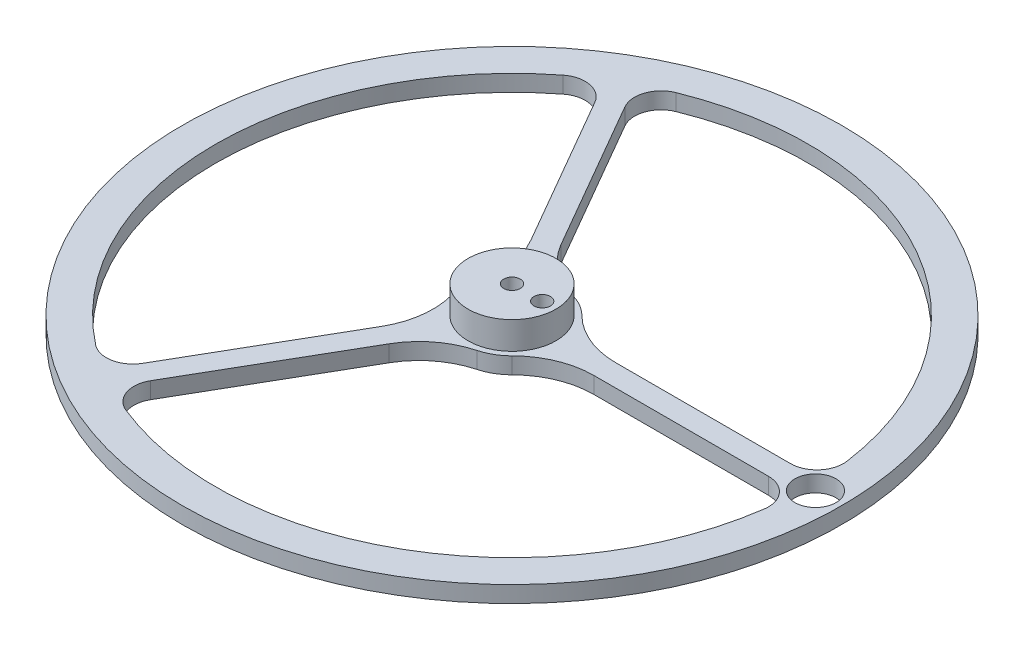
ISO-10303-21;
HEADER;
FILE_DESCRIPTION(('STEP AP214'),'2;1');
FILE_NAME('part.step','',(''),(''),'','','');
FILE_SCHEMA(('AUTOMOTIVE_DESIGN { 1 0 10303 214 1 1 1 1 }'));
ENDSEC;
DATA;
#1=APPLICATION_CONTEXT('core data for automotive mechanical design processes');
#2=APPLICATION_PROTOCOL_DEFINITION('international standard','automotive_design',2000,#1);
#3=PRODUCT_CONTEXT('',#1,'mechanical');
#4=PRODUCT('Part','Part','',(#3));
#5=PRODUCT_RELATED_PRODUCT_CATEGORY('part','',(#4));
#6=PRODUCT_DEFINITION_FORMATION('','',#4);
#7=PRODUCT_DEFINITION_CONTEXT('part definition',#1,'design');
#8=PRODUCT_DEFINITION('design','',#6,#7);
#9=PRODUCT_DEFINITION_SHAPE('','',#8);
#10=(LENGTH_UNIT() NAMED_UNIT(*) SI_UNIT(.MILLI.,.METRE.));
#11=(NAMED_UNIT(*) PLANE_ANGLE_UNIT() SI_UNIT($,.RADIAN.));
#12=(NAMED_UNIT(*) SI_UNIT($,.STERADIAN.) SOLID_ANGLE_UNIT());
#13=UNCERTAINTY_MEASURE_WITH_UNIT(LENGTH_MEASURE(1.E-05),#10,'distance_accuracy_value','');
#14=(GEOMETRIC_REPRESENTATION_CONTEXT(3) GLOBAL_UNCERTAINTY_ASSIGNED_CONTEXT((#13)) GLOBAL_UNIT_ASSIGNED_CONTEXT((#10,
#11,#12)) REPRESENTATION_CONTEXT('',''));
#15=CARTESIAN_POINT('',(0.,0.,0.));
#16=DIRECTION('',(0.,0.,1.));
#17=DIRECTION('',(1.,0.,0.));
#18=AXIS2_PLACEMENT_3D('',#15,#16,#17);
#19=CARTESIAN_POINT('',(0.,3.,0.));
#20=DIRECTION('',(0.,-1.,0.));
#21=DIRECTION('',(0.,0.,-1.));
#22=AXIS2_PLACEMENT_3D('',#19,#20,#21);
#23=CYLINDRICAL_SURFACE('',#22,54.);
#24=DIRECTION('',(0.,-1.,0.));
#25=VECTOR('',#24,1.);
#26=CARTESIAN_POINT('',(-33.2335057333473,55.9166560086537,-42.5621204437886));
#27=LINE('',#26,#25);
#28=CARTESIAN_POINT('',(-33.2335057333473,3.,-42.5621204437886));
#29=VERTEX_POINT('',#28);
#30=CARTESIAN_POINT('',(-33.2335057333473,0.,-42.5621204437886));
#31=VERTEX_POINT('',#30);
#32=EDGE_CURVE('E271',#29,#31,#27,.T.);
#33=ORIENTED_EDGE('',*,*,#32,.F.);
#34=CARTESIAN_POINT('',(0.,3.,0.));
#35=DIRECTION('',(0.,1.,0.));
#36=DIRECTION('',(0.,0.,1.));
#37=AXIS2_PLACEMENT_3D('',#34,#35,#36);
#38=CIRCLE('',#37,54.);
#39=CARTESIAN_POINT('',(-33.2335057333467,3.,42.5621204437891));
#40=VERTEX_POINT('',#39);
#41=EDGE_CURVE('E459',#29,#40,#38,.T.);
#42=ORIENTED_EDGE('',*,*,#41,.T.);
#43=DIRECTION('',(0.,-1.,0.));
#44=VECTOR('',#43,1.);
#45=CARTESIAN_POINT('',(-33.2335057333467,55.9166560086537,42.5621204437891));
#46=LINE('',#45,#44);
#47=CARTESIAN_POINT('',(-33.2335057333467,0.,42.5621204437891));
#48=VERTEX_POINT('',#47);
#49=EDGE_CURVE('E329',#40,#48,#46,.T.);
#50=ORIENTED_EDGE('',*,*,#49,.T.);
#51=CARTESIAN_POINT('',(0.,0.,0.));
#52=DIRECTION('',(0.,1.,0.));
#53=DIRECTION('',(0.,0.,1.));
#54=AXIS2_PLACEMENT_3D('',#51,#52,#53);
#55=CIRCLE('',#54,54.);
#56=EDGE_CURVE('E463',#31,#48,#55,.T.);
#57=ORIENTED_EDGE('',*,*,#56,.F.);
#58=EDGE_LOOP('',(#33,#42,#50,#57));
#59=FACE_BOUND('',#58,.T.);
#60=ADVANCED_FACE('F43',(#59),#23,.F.);
#61=DIRECTION('',(0.,-1.,0.));
#62=VECTOR('',#61,1.);
#63=CARTESIAN_POINT('',(-20.2431246765801,54.4469309590523,50.062120443789));
#64=LINE('',#63,#62);
#65=CARTESIAN_POINT('',(-20.2431246765801,3.,50.062120443789));
#66=VERTEX_POINT('',#65);
#67=CARTESIAN_POINT('',(-20.2431246765801,0.,50.062120443789));
#68=VERTEX_POINT('',#67);
#69=EDGE_CURVE('E308',#66,#68,#64,.T.);
#70=ORIENTED_EDGE('',*,*,#69,.F.);
#71=CARTESIAN_POINT('',(53.4766304099277,3.,7.50000000000001));
#72=VERTEX_POINT('',#71);
#73=EDGE_CURVE('E460',#66,#72,#38,.T.);
#74=ORIENTED_EDGE('',*,*,#73,.T.);
#75=DIRECTION('',(0.,-1.,0.));
#76=VECTOR('',#75,1.);
#77=CARTESIAN_POINT('',(53.4766304099277,51.2228390774193,7.5));
#78=LINE('',#77,#76);
#79=CARTESIAN_POINT('',(53.4766304099277,0.,7.5));
#80=VERTEX_POINT('',#79);
#81=EDGE_CURVE('E422',#72,#80,#78,.T.);
#82=ORIENTED_EDGE('',*,*,#81,.T.);
#83=EDGE_CURVE('E437',#68,#80,#55,.T.);
#84=ORIENTED_EDGE('',*,*,#83,.F.);
#85=EDGE_LOOP('',(#70,#74,#82,#84));
#86=FACE_BOUND('',#85,.T.);
#87=ADVANCED_FACE('F486',(#86),#23,.F.);
#88=CARTESIAN_POINT('',(0.,3.,0.));
#89=DIRECTION('',(0.,-1.,0.));
#90=DIRECTION('',(0.,0.,-1.));
#91=AXIS2_PLACEMENT_3D('',#88,#89,#90);
#92=CYLINDRICAL_SURFACE('',#91,9.);
#93=CARTESIAN_POINT('',(0.,3.,0.));
#94=DIRECTION('',(0.,1.,0.));
#95=DIRECTION('',(0.,0.,1.));
#96=AXIS2_PLACEMENT_3D('',#93,#94,#95);
#97=CIRCLE('',#96,9.);
#98=CARTESIAN_POINT('',(-8.69333243660163,3.,-2.32937140592264));
#99=VERTEX_POINT('',#98);
#100=CARTESIAN_POINT('',(-8.6933324366016,3.,2.32937140592276));
#101=VERTEX_POINT('',#100);
#102=EDGE_CURVE('E412',#99,#101,#97,.T.);
#103=ORIENTED_EDGE('',*,*,#102,.F.);
#104=DIRECTION('',(0.,-1.,0.));
#105=VECTOR('',#104,1.);
#106=CARTESIAN_POINT('',(-8.69333243660163,55.9166560086537,-2.32937140592264));
#107=LINE('',#106,#105);
#108=CARTESIAN_POINT('',(-8.69333243660163,0.,-2.32937140592264));
#109=VERTEX_POINT('',#108);
#110=EDGE_CURVE('E280',#99,#109,#107,.T.);
#111=ORIENTED_EDGE('',*,*,#110,.T.);
#112=CARTESIAN_POINT('',(0.,0.,0.));
#113=DIRECTION('',(0.,1.,0.));
#114=DIRECTION('',(0.,0.,1.));
#115=AXIS2_PLACEMENT_3D('',#112,#113,#114);
#116=CIRCLE('',#115,9.);
#117=CARTESIAN_POINT('',(-8.6933324366016,0.,2.32937140592276));
#118=VERTEX_POINT('',#117);
#119=EDGE_CURVE('E417',#109,#118,#116,.T.);
#120=ORIENTED_EDGE('',*,*,#119,.T.);
#121=DIRECTION('',(0.,-1.,0.));
#122=VECTOR('',#121,1.);
#123=CARTESIAN_POINT('',(-8.6933324366016,55.9166560086537,2.32937140592276));
#124=LINE('',#123,#122);
#125=EDGE_CURVE('E324',#101,#118,#124,.T.);
#126=ORIENTED_EDGE('',*,*,#125,.F.);
#127=EDGE_LOOP('',(#103,#111,#120,#126));
#128=FACE_BOUND('',#127,.T.);
#129=ADVANCED_FACE('F493',(#128),#92,.T.);
#130=CARTESIAN_POINT('',(2.32937140592278,3.,8.69333243660159));
#131=VERTEX_POINT('',#130);
#132=CARTESIAN_POINT('',(6.36396103067892,3.,6.36396103067893));
#133=VERTEX_POINT('',#132);
#134=EDGE_CURVE('E413',#131,#133,#97,.T.);
#135=ORIENTED_EDGE('',*,*,#134,.F.);
#136=DIRECTION('',(0.,-1.,0.));
#137=VECTOR('',#136,1.);
#138=CARTESIAN_POINT('',(2.32937140592278,54.4469309590523,8.69333243660159));
#139=LINE('',#138,#137);
#140=CARTESIAN_POINT('',(2.32937140592278,0.,8.69333243660159));
#141=VERTEX_POINT('',#140);
#142=EDGE_CURVE('E317',#131,#141,#139,.T.);
#143=ORIENTED_EDGE('',*,*,#142,.T.);
#144=CARTESIAN_POINT('',(6.36396103067892,0.,6.36396103067893));
#145=VERTEX_POINT('',#144);
#146=EDGE_CURVE('E404',#141,#145,#116,.T.);
#147=ORIENTED_EDGE('',*,*,#146,.T.);
#148=DIRECTION('',(0.,-1.,0.));
#149=VECTOR('',#148,1.);
#150=CARTESIAN_POINT('',(6.36396103067892,51.2228390774193,6.36396103067893));
#151=LINE('',#150,#149);
#152=EDGE_CURVE('E409',#133,#145,#151,.T.);
#153=ORIENTED_EDGE('',*,*,#152,.F.);
#154=EDGE_LOOP('',(#135,#143,#147,#153));
#155=FACE_BOUND('',#154,.T.);
#156=ADVANCED_FACE('F497',(#155),#92,.T.);
#157=DIRECTION('',(0.,-1.,0.));
#158=VECTOR('',#157,1.);
#159=CARTESIAN_POINT('',(53.4766304099277,51.2228390774193,-7.49999999999999));
#160=LINE('',#159,#158);
#161=CARTESIAN_POINT('',(53.4766304099277,3.,-7.49999999999999));
#162=VERTEX_POINT('',#161);
#163=CARTESIAN_POINT('',(53.4766304099277,0.,-7.49999999999999));
#164=VERTEX_POINT('',#163);
#165=EDGE_CURVE('E69',#162,#164,#160,.T.);
#166=ORIENTED_EDGE('',*,*,#165,.F.);
#167=CARTESIAN_POINT('',(-20.2431246765808,3.00000000000002,-50.0621204437887));
#168=VERTEX_POINT('',#167);
#169=EDGE_CURVE('E456',#162,#168,#38,.T.);
#170=ORIENTED_EDGE('',*,*,#169,.T.);
#171=DIRECTION('',(0.,-1.,0.));
#172=VECTOR('',#171,1.);
#173=CARTESIAN_POINT('',(-20.2431246765808,54.4469309590524,-50.0621204437887));
#174=LINE('',#173,#172);
#175=CARTESIAN_POINT('',(-20.2431246765808,0.,-50.0621204437887));
#176=VERTEX_POINT('',#175);
#177=EDGE_CURVE('E367',#168,#176,#174,.T.);
#178=ORIENTED_EDGE('',*,*,#177,.T.);
#179=EDGE_CURVE('E461',#164,#176,#55,.T.);
#180=ORIENTED_EDGE('',*,*,#179,.F.);
#181=EDGE_LOOP('',(#166,#170,#178,#180));
#182=FACE_BOUND('',#181,.T.);
#183=ADVANCED_FACE('F489',(#182),#23,.F.);
#184=CARTESIAN_POINT('',(6.36396103067892,3.,-6.36396103067893));
#185=VERTEX_POINT('',#184);
#186=CARTESIAN_POINT('',(2.32937140592266,3.00000000000002,-8.69333243660163));
#187=VERTEX_POINT('',#186);
#188=EDGE_CURVE('E61',#185,#187,#97,.T.);
#189=ORIENTED_EDGE('',*,*,#188,.F.);
#190=DIRECTION('',(0.,-1.,0.));
#191=VECTOR('',#190,1.);
#192=CARTESIAN_POINT('',(6.36396103067892,51.2228390774193,-6.36396103067894));
#193=LINE('',#192,#191);
#194=CARTESIAN_POINT('',(6.36396103067892,0.,-6.36396103067893));
#195=VERTEX_POINT('',#194);
#196=EDGE_CURVE('E231',#185,#195,#193,.T.);
#197=ORIENTED_EDGE('',*,*,#196,.T.);
#198=CARTESIAN_POINT('',(2.32937140592266,0.,-8.69333243660163));
#199=VERTEX_POINT('',#198);
#200=EDGE_CURVE('E414',#195,#199,#116,.T.);
#201=ORIENTED_EDGE('',*,*,#200,.T.);
#202=DIRECTION('',(0.,-1.,0.));
#203=VECTOR('',#202,1.);
#204=CARTESIAN_POINT('',(2.32937140592266,54.4469309590524,-8.69333243660163));
#205=LINE('',#204,#203);
#206=EDGE_CURVE('E344',#187,#199,#205,.T.);
#207=ORIENTED_EDGE('',*,*,#206,.F.);
#208=EDGE_LOOP('',(#189,#197,#201,#207));
#209=FACE_BOUND('',#208,.T.);
#210=ADVANCED_FACE('F480',(#209),#92,.T.);
#211=CARTESIAN_POINT('',(0.,3.,0.));
#212=DIRECTION('',(0.,1.,0.));
#213=DIRECTION('',(0.,0.,1.));
#214=AXIS2_PLACEMENT_3D('',#211,#212,#213);
#215=PLANE('',#214);
#216=CARTESIAN_POINT('',(55.25,3.,0.));
#217=DIRECTION('',(0.,1.,0.));
#218=DIRECTION('',(0.,0.,1.));
#219=AXIS2_PLACEMENT_3D('',#216,#217,#218);
#220=CIRCLE('',#219,3.75000000000001);
#221=CARTESIAN_POINT('',(55.25,3.,3.75000000000001));
#222=VERTEX_POINT('',#221);
#223=EDGE_CURVE('E987',#222,#222,#220,.T.);
#224=ORIENTED_EDGE('',*,*,#223,.F.);
#225=EDGE_LOOP('',(#224));
#226=FACE_BOUND('',#225,.T.);
#227=ORIENTED_EDGE('',*,*,#169,.F.);
#228=CARTESIAN_POINT('',(48.694167527739,3.,-6.82926829268293));
#229=DIRECTION('',(0.,1.,0.));
#230=DIRECTION('',(0.,0.,1.));
#231=AXIS2_PLACEMENT_3D('',#228,#229,#230);
#232=CIRCLE('',#231,4.82926829268293);
#233=CARTESIAN_POINT('',(48.694167527739,3.,-2.));
#234=VERTEX_POINT('',#233);
#235=EDGE_CURVE('E214',#234,#162,#232,.T.);
#236=ORIENTED_EDGE('',*,*,#235,.F.);
#237=DIRECTION('',(1.,0.,0.));
#238=VECTOR('',#237,1.);
#239=CARTESIAN_POINT('',(16.8994949366117,3.,-2.));
#240=LINE('',#239,#238);
#241=CARTESIAN_POINT('',(16.8994949366117,3.,-2.));
#242=VERTEX_POINT('',#241);
#243=EDGE_CURVE('E206',#242,#234,#240,.T.);
#244=ORIENTED_EDGE('',*,*,#243,.F.);
#245=CARTESIAN_POINT('',(16.8994949366117,3.,-16.8994949366117));
#246=DIRECTION('',(0.,1.,0.));
#247=DIRECTION('',(0.,0.,1.));
#248=AXIS2_PLACEMENT_3D('',#245,#246,#247);
#249=CIRCLE('',#248,14.8994949366117);
#250=EDGE_CURVE('E211',#185,#242,#249,.T.);
#251=ORIENTED_EDGE('',*,*,#250,.F.);
#252=ORIENTED_EDGE('',*,*,#188,.T.);
#253=CARTESIAN_POINT('',(6.18564445792628,3.,-23.0851393945381));
#254=DIRECTION('',(0.,1.,0.));
#255=DIRECTION('',(0.,0.,1.));
#256=AXIS2_PLACEMENT_3D('',#253,#254,#255);
#257=CIRCLE('',#256,14.8994949366117);
#258=CARTESIAN_POINT('',(-6.71769666073704,3.00000000000002,-15.6353919262322));
#259=VERTEX_POINT('',#258);
#260=EDGE_CURVE('E387',#187,#259,#257,.F.);
#261=ORIENTED_EDGE('',*,*,#260,.T.);
#262=DIRECTION('',(-0.500000000000004,0.,-0.866025403784436));
#263=VECTOR('',#262,1.);
#264=CARTESIAN_POINT('',(-6.71769666073704,3.,-15.6353919262322));
#265=LINE('',#264,#263);
#266=CARTESIAN_POINT('',(-22.6150329563008,3.00000000000002,-43.1703860951572));
#267=VERTEX_POINT('',#266);
#268=EDGE_CURVE('E383',#259,#267,#265,.T.);
#269=ORIENTED_EDGE('',*,*,#268,.T.);
#270=CARTESIAN_POINT('',(-18.4327639331467,3.,-45.5850202414987));
#271=DIRECTION('',(0.,1.,0.));
#272=DIRECTION('',(0.,0.,1.));
#273=AXIS2_PLACEMENT_3D('',#270,#271,#272);
#274=CIRCLE('',#273,4.82926829268293);
#275=EDGE_CURVE('E378',#267,#168,#274,.F.);
#276=ORIENTED_EDGE('',*,*,#275,.T.);
#277=EDGE_LOOP('',(#227,#236,#244,#251,#252,#261,#269,#276));
#278=FACE_BOUND('',#277,.T.);
#279=ORIENTED_EDGE('',*,*,#41,.F.);
#280=CARTESIAN_POINT('',(-30.2614035945927,3.,-38.7557519488157));
#281=DIRECTION('',(0.,1.,0.));
#282=DIRECTION('',(0.,0.,1.));
#283=AXIS2_PLACEMENT_3D('',#280,#281,#282);
#284=CIRCLE('',#283,4.82926829268293);
#285=CARTESIAN_POINT('',(-26.0791345714386,3.,-41.1703860951572));
#286=VERTEX_POINT('',#285);
#287=EDGE_CURVE('E267',#286,#29,#284,.T.);
#288=ORIENTED_EDGE('',*,*,#287,.F.);
#289=DIRECTION('',(-0.500000000000004,0.,-0.866025403784436));
#290=VECTOR('',#289,1.);
#291=CARTESIAN_POINT('',(-10.1817982758748,3.,-13.6353919262322));
#292=LINE('',#291,#290);
#293=CARTESIAN_POINT('',(-10.1817982758748,3.,-13.6353919262322));
#294=VERTEX_POINT('',#293);
#295=EDGE_CURVE('E273',#294,#286,#292,.T.);
#296=ORIENTED_EDGE('',*,*,#295,.F.);
#297=CARTESIAN_POINT('',(-23.0851393945381,3.,-6.18564445792625));
#298=DIRECTION('',(0.,1.,0.));
#299=DIRECTION('',(0.,0.,1.));
#300=AXIS2_PLACEMENT_3D('',#297,#298,#299);
#301=CIRCLE('',#300,14.8994949366117);
#302=EDGE_CURVE('E262',#99,#294,#301,.T.);
#303=ORIENTED_EDGE('',*,*,#302,.F.);
#304=ORIENTED_EDGE('',*,*,#102,.T.);
#305=CARTESIAN_POINT('',(-23.085139394538,3.,6.18564445792657));
#306=DIRECTION('',(0.,1.,0.));
#307=DIRECTION('',(0.,0.,1.));
#308=AXIS2_PLACEMENT_3D('',#305,#306,#307);
#309=CIRCLE('',#308,14.8994949366117);
#310=CARTESIAN_POINT('',(-10.1817982758746,3.,13.6353919262323));
#311=VERTEX_POINT('',#310);
#312=EDGE_CURVE('E349',#101,#311,#309,.F.);
#313=ORIENTED_EDGE('',*,*,#312,.T.);
#314=DIRECTION('',(-0.499999999999992,0.,0.866025403784443));
#315=VECTOR('',#314,1.);
#316=CARTESIAN_POINT('',(-10.1817982758746,3.,13.6353919262323));
#317=LINE('',#316,#315);
#318=CARTESIAN_POINT('',(-26.079134571438,3.,41.1703860951575));
#319=VERTEX_POINT('',#318);
#320=EDGE_CURVE('E345',#311,#319,#317,.T.);
#321=ORIENTED_EDGE('',*,*,#320,.T.);
#322=CARTESIAN_POINT('',(-30.2614035945921,3.,38.7557519488161));
#323=DIRECTION('',(0.,1.,0.));
#324=DIRECTION('',(0.,0.,1.));
#325=AXIS2_PLACEMENT_3D('',#322,#323,#324);
#326=CIRCLE('',#325,4.82926829268293);
#327=EDGE_CURVE('E340',#319,#40,#326,.F.);
#328=ORIENTED_EDGE('',*,*,#327,.T.);
#329=EDGE_LOOP('',(#279,#288,#296,#303,#304,#313,#321,#328));
#330=FACE_BOUND('',#329,.T.);
#331=ORIENTED_EDGE('',*,*,#73,.F.);
#332=CARTESIAN_POINT('',(-18.4327639331461,3.,45.5850202414989));
#333=DIRECTION('',(0.,1.,0.));
#334=DIRECTION('',(0.,0.,1.));
#335=AXIS2_PLACEMENT_3D('',#332,#333,#334);
#336=CIRCLE('',#335,4.82926829268293);
#337=CARTESIAN_POINT('',(-22.6150329563002,3.,43.1703860951575));
#338=VERTEX_POINT('',#337);
#339=EDGE_CURVE('E304',#338,#66,#336,.T.);
#340=ORIENTED_EDGE('',*,*,#339,.F.);
#341=DIRECTION('',(-0.499999999999992,0.,0.866025403784443));
#342=VECTOR('',#341,1.);
#343=CARTESIAN_POINT('',(-6.71769666073682,3.,15.6353919262323));
#344=LINE('',#343,#342);
#345=CARTESIAN_POINT('',(-6.71769666073682,3.,15.6353919262323));
#346=VERTEX_POINT('',#345);
#347=EDGE_CURVE('E310',#346,#338,#344,.T.);
#348=ORIENTED_EDGE('',*,*,#347,.F.);
#349=CARTESIAN_POINT('',(6.18564445792661,3.,23.085139394538));
#350=DIRECTION('',(0.,1.,0.));
#351=DIRECTION('',(0.,0.,1.));
#352=AXIS2_PLACEMENT_3D('',#349,#350,#351);
#353=CIRCLE('',#352,14.8994949366117);
#354=EDGE_CURVE('E299',#131,#346,#353,.T.);
#355=ORIENTED_EDGE('',*,*,#354,.F.);
#356=ORIENTED_EDGE('',*,*,#134,.T.);
#357=CARTESIAN_POINT('',(16.8994949366117,3.,16.8994949366117));
#358=DIRECTION('',(0.,1.,0.));
#359=DIRECTION('',(0.,0.,1.));
#360=AXIS2_PLACEMENT_3D('',#357,#358,#359);
#361=CIRCLE('',#360,14.8994949366117);
#362=CARTESIAN_POINT('',(16.8994949366117,3.,2.));
#363=VERTEX_POINT('',#362);
#364=EDGE_CURVE('E442',#133,#363,#361,.F.);
#365=ORIENTED_EDGE('',*,*,#364,.T.);
#366=DIRECTION('',(1.,0.,0.));
#367=VECTOR('',#366,1.);
#368=CARTESIAN_POINT('',(16.8994949366117,3.,2.));
#369=LINE('',#368,#367);
#370=CARTESIAN_POINT('',(48.694167527739,3.,2.));
#371=VERTEX_POINT('',#370);
#372=EDGE_CURVE('E438',#363,#371,#369,.T.);
#373=ORIENTED_EDGE('',*,*,#372,.T.);
#374=CARTESIAN_POINT('',(48.694167527739,3.,6.82926829268293));
#375=DIRECTION('',(0.,1.,0.));
#376=DIRECTION('',(0.,0.,1.));
#377=AXIS2_PLACEMENT_3D('',#374,#375,#376);
#378=CIRCLE('',#377,4.82926829268293);
#379=EDGE_CURVE('E433',#371,#72,#378,.F.);
#380=ORIENTED_EDGE('',*,*,#379,.T.);
#381=EDGE_LOOP('',(#331,#340,#348,#355,#356,#365,#373,#380));
#382=FACE_BOUND('',#381,.T.);
#383=CARTESIAN_POINT('',(0.,3.,0.));
#384=DIRECTION('',(0.,1.,0.));
#385=DIRECTION('',(0.,0.,1.));
#386=AXIS2_PLACEMENT_3D('',#383,#384,#385);
#387=CIRCLE('',#386,60.);
#388=CARTESIAN_POINT('',(0.,3.,60.));
#389=VERTEX_POINT('',#388);
#390=EDGE_CURVE('E11',#389,#389,#387,.T.);
#391=ORIENTED_EDGE('',*,*,#390,.T.);
#392=EDGE_LOOP('',(#391));
#393=FACE_BOUND('',#392,.T.);
#394=CARTESIAN_POINT('',(0.,3.,0.));
#395=DIRECTION('',(0.,1.,0.));
#396=DIRECTION('',(0.,0.,1.));
#397=AXIS2_PLACEMENT_3D('',#394,#395,#396);
#398=CIRCLE('',#397,8.);
#399=CARTESIAN_POINT('',(0.,3.,8.));
#400=VERTEX_POINT('',#399);
#401=EDGE_CURVE('E405',#400,#400,#398,.T.);
#402=ORIENTED_EDGE('',*,*,#401,.F.);
#403=EDGE_LOOP('',(#402));
#404=FACE_BOUND('',#403,.T.);
#405=ADVANCED_FACE('F208',(#226,#278,#330,#382,#393,#404),#215,.T.);
#406=CARTESIAN_POINT('',(0.,0.,0.));
#407=DIRECTION('',(0.,1.,0.));
#408=DIRECTION('',(0.,0.,1.));
#409=AXIS2_PLACEMENT_3D('',#406,#407,#408);
#410=PLANE('',#409);
#411=CARTESIAN_POINT('',(55.25,0.,0.));
#412=DIRECTION('',(0.,1.,0.));
#413=DIRECTION('',(0.,0.,1.));
#414=AXIS2_PLACEMENT_3D('',#411,#412,#413);
#415=CIRCLE('',#414,3.75000000000001);
#416=CARTESIAN_POINT('',(55.25,0.,3.75000000000001));
#417=VERTEX_POINT('',#416);
#418=EDGE_CURVE('E989',#417,#417,#415,.T.);
#419=ORIENTED_EDGE('',*,*,#418,.T.);
#420=EDGE_LOOP('',(#419));
#421=FACE_BOUND('',#420,.T.);
#422=CARTESIAN_POINT('',(0.,0.,0.));
#423=DIRECTION('',(0.,1.,0.));
#424=DIRECTION('',(0.,0.,1.));
#425=AXIS2_PLACEMENT_3D('',#422,#423,#424);
#426=CIRCLE('',#425,1.5);
#427=CARTESIAN_POINT('',(0.,0.,1.5));
#428=VERTEX_POINT('',#427);
#429=EDGE_CURVE('E636',#428,#428,#426,.T.);
#430=ORIENTED_EDGE('',*,*,#429,.T.);
#431=EDGE_LOOP('',(#430));
#432=FACE_BOUND('',#431,.T.);
#433=CARTESIAN_POINT('',(48.694167527739,0.,-6.82926829268293));
#434=DIRECTION('',(0.,1.,0.));
#435=DIRECTION('',(0.,0.,1.));
#436=AXIS2_PLACEMENT_3D('',#433,#434,#435);
#437=CIRCLE('',#436,4.82926829268293);
#438=CARTESIAN_POINT('',(48.694167527739,0.,-2.));
#439=VERTEX_POINT('',#438);
#440=EDGE_CURVE('E233',#439,#164,#437,.T.);
#441=ORIENTED_EDGE('',*,*,#440,.T.);
#442=ORIENTED_EDGE('',*,*,#179,.T.);
#443=CARTESIAN_POINT('',(-18.4327639331467,0.,-45.5850202414987));
#444=DIRECTION('',(0.,-1.,0.));
#445=DIRECTION('',(-0.866025403784436,0.,0.500000000000004));
#446=AXIS2_PLACEMENT_3D('',#443,#444,#445);
#447=CIRCLE('',#446,4.82926829268293);
#448=CARTESIAN_POINT('',(-22.6150329563008,0.,-43.1703860951572));
#449=VERTEX_POINT('',#448);
#450=EDGE_CURVE('E363',#449,#176,#447,.T.);
#451=ORIENTED_EDGE('',*,*,#450,.F.);
#452=DIRECTION('',(-0.500000000000004,0.,-0.866025403784436));
#453=VECTOR('',#452,1.);
#454=CARTESIAN_POINT('',(-6.71769666073704,0.,-15.6353919262322));
#455=LINE('',#454,#453);
#456=CARTESIAN_POINT('',(-6.71769666073704,0.,-15.6353919262322));
#457=VERTEX_POINT('',#456);
#458=EDGE_CURVE('E369',#457,#449,#455,.T.);
#459=ORIENTED_EDGE('',*,*,#458,.F.);
#460=CARTESIAN_POINT('',(6.18564445792628,0.,-23.0851393945381));
#461=DIRECTION('',(0.,-1.,0.));
#462=DIRECTION('',(0.866025403784436,0.,-0.500000000000004));
#463=AXIS2_PLACEMENT_3D('',#460,#461,#462);
#464=CIRCLE('',#463,14.8994949366117);
#465=EDGE_CURVE('E374',#199,#457,#464,.T.);
#466=ORIENTED_EDGE('',*,*,#465,.F.);
#467=ORIENTED_EDGE('',*,*,#200,.F.);
#468=CARTESIAN_POINT('',(16.8994949366117,0.,-16.8994949366117));
#469=DIRECTION('',(0.,1.,0.));
#470=DIRECTION('',(0.,0.,-1.));
#471=AXIS2_PLACEMENT_3D('',#468,#469,#470);
#472=CIRCLE('',#471,14.8994949366117);
#473=CARTESIAN_POINT('',(16.8994949366117,0.,-2.));
#474=VERTEX_POINT('',#473);
#475=EDGE_CURVE('E634',#195,#474,#472,.T.);
#476=ORIENTED_EDGE('',*,*,#475,.T.);
#477=DIRECTION('',(1.,0.,0.));
#478=VECTOR('',#477,1.);
#479=CARTESIAN_POINT('',(16.8994949366117,0.,-2.));
#480=LINE('',#479,#478);
#481=EDGE_CURVE('E224',#474,#439,#480,.T.);
#482=ORIENTED_EDGE('',*,*,#481,.T.);
#483=EDGE_LOOP('',(#441,#442,#451,#459,#466,#467,#476,#482));
#484=FACE_BOUND('',#483,.T.);
#485=CARTESIAN_POINT('',(-30.2614035945927,0.,-38.7557519488157));
#486=DIRECTION('',(0.,1.,0.));
#487=DIRECTION('',(0.866025403784436,0.,-0.500000000000004));
#488=AXIS2_PLACEMENT_3D('',#485,#486,#487);
#489=CIRCLE('',#488,4.82926829268293);
#490=CARTESIAN_POINT('',(-26.0791345714386,0.,-41.1703860951572));
#491=VERTEX_POINT('',#490);
#492=EDGE_CURVE('E258',#491,#31,#489,.T.);
#493=ORIENTED_EDGE('',*,*,#492,.T.);
#494=ORIENTED_EDGE('',*,*,#56,.T.);
#495=CARTESIAN_POINT('',(-30.2614035945921,0.,38.7557519488161));
#496=DIRECTION('',(0.,-1.,0.));
#497=DIRECTION('',(0.866025403784443,0.,0.499999999999992));
#498=AXIS2_PLACEMENT_3D('',#495,#496,#497);
#499=CIRCLE('',#498,4.82926829268293);
#500=CARTESIAN_POINT('',(-26.079134571438,0.,41.1703860951575));
#501=VERTEX_POINT('',#500);
#502=EDGE_CURVE('E325',#501,#48,#499,.T.);
#503=ORIENTED_EDGE('',*,*,#502,.F.);
#504=DIRECTION('',(-0.499999999999992,0.,0.866025403784443));
#505=VECTOR('',#504,1.);
#506=CARTESIAN_POINT('',(-10.1817982758746,0.,13.6353919262323));
#507=LINE('',#506,#505);
#508=CARTESIAN_POINT('',(-10.1817982758746,0.,13.6353919262323));
#509=VERTEX_POINT('',#508);
#510=EDGE_CURVE('E331',#509,#501,#507,.T.);
#511=ORIENTED_EDGE('',*,*,#510,.F.);
#512=CARTESIAN_POINT('',(-23.085139394538,0.,6.18564445792657));
#513=DIRECTION('',(0.,-1.,0.));
#514=DIRECTION('',(-0.866025403784443,0.,-0.499999999999992));
#515=AXIS2_PLACEMENT_3D('',#512,#513,#514);
#516=CIRCLE('',#515,14.8994949366117);
#517=EDGE_CURVE('E336',#118,#509,#516,.T.);
#518=ORIENTED_EDGE('',*,*,#517,.F.);
#519=ORIENTED_EDGE('',*,*,#119,.F.);
#520=CARTESIAN_POINT('',(-23.0851393945381,0.,-6.18564445792625));
#521=DIRECTION('',(0.,1.,0.));
#522=DIRECTION('',(-0.866025403784436,0.,0.500000000000004));
#523=AXIS2_PLACEMENT_3D('',#520,#521,#522);
#524=CIRCLE('',#523,14.8994949366117);
#525=CARTESIAN_POINT('',(-10.1817982758748,0.,-13.6353919262322));
#526=VERTEX_POINT('',#525);
#527=EDGE_CURVE('E250',#109,#526,#524,.T.);
#528=ORIENTED_EDGE('',*,*,#527,.T.);
#529=DIRECTION('',(-0.500000000000004,0.,-0.866025403784436));
#530=VECTOR('',#529,1.);
#531=CARTESIAN_POINT('',(-10.1817982758748,0.,-13.6353919262322));
#532=LINE('',#531,#530);
#533=EDGE_CURVE('E254',#526,#491,#532,.T.);
#534=ORIENTED_EDGE('',*,*,#533,.T.);
#535=EDGE_LOOP('',(#493,#494,#503,#511,#518,#519,#528,#534));
#536=FACE_BOUND('',#535,.T.);
#537=CARTESIAN_POINT('',(-18.4327639331461,0.,45.5850202414989));
#538=DIRECTION('',(0.,1.,0.));
#539=DIRECTION('',(-0.866025403784443,0.,-0.499999999999992));
#540=AXIS2_PLACEMENT_3D('',#537,#538,#539);
#541=CIRCLE('',#540,4.82926829268293);
#542=CARTESIAN_POINT('',(-22.6150329563002,0.,43.1703860951575));
#543=VERTEX_POINT('',#542);
#544=EDGE_CURVE('E295',#543,#68,#541,.T.);
#545=ORIENTED_EDGE('',*,*,#544,.T.);
#546=ORIENTED_EDGE('',*,*,#83,.T.);
#547=CARTESIAN_POINT('',(48.694167527739,0.,6.82926829268293));
#548=DIRECTION('',(0.,-1.,0.));
#549=DIRECTION('',(0.,0.,-1.));
#550=AXIS2_PLACEMENT_3D('',#547,#548,#549);
#551=CIRCLE('',#550,4.82926829268293);
#552=CARTESIAN_POINT('',(48.694167527739,0.,2.));
#553=VERTEX_POINT('',#552);
#554=EDGE_CURVE('E418',#553,#80,#551,.T.);
#555=ORIENTED_EDGE('',*,*,#554,.F.);
#556=DIRECTION('',(1.,0.,0.));
#557=VECTOR('',#556,1.);
#558=CARTESIAN_POINT('',(16.8994949366117,0.,2.));
#559=LINE('',#558,#557);
#560=CARTESIAN_POINT('',(16.8994949366117,0.,2.));
#561=VERTEX_POINT('',#560);
#562=EDGE_CURVE('E424',#561,#553,#559,.T.);
#563=ORIENTED_EDGE('',*,*,#562,.F.);
#564=CARTESIAN_POINT('',(16.8994949366117,0.,16.8994949366117));
#565=DIRECTION('',(0.,-1.,0.));
#566=DIRECTION('',(0.,0.,1.));
#567=AXIS2_PLACEMENT_3D('',#564,#565,#566);
#568=CIRCLE('',#567,14.8994949366117);
#569=EDGE_CURVE('E429',#145,#561,#568,.T.);
#570=ORIENTED_EDGE('',*,*,#569,.F.);
#571=ORIENTED_EDGE('',*,*,#146,.F.);
#572=CARTESIAN_POINT('',(6.18564445792661,0.,23.085139394538));
#573=DIRECTION('',(0.,1.,0.));
#574=DIRECTION('',(0.866025403784443,0.,0.499999999999992));
#575=AXIS2_PLACEMENT_3D('',#572,#573,#574);
#576=CIRCLE('',#575,14.8994949366117);
#577=CARTESIAN_POINT('',(-6.71769666073682,0.,15.6353919262323));
#578=VERTEX_POINT('',#577);
#579=EDGE_CURVE('E287',#141,#578,#576,.T.);
#580=ORIENTED_EDGE('',*,*,#579,.T.);
#581=DIRECTION('',(-0.499999999999992,0.,0.866025403784443));
#582=VECTOR('',#581,1.);
#583=CARTESIAN_POINT('',(-6.71769666073682,0.,15.6353919262323));
#584=LINE('',#583,#582);
#585=EDGE_CURVE('E291',#578,#543,#584,.T.);
#586=ORIENTED_EDGE('',*,*,#585,.T.);
#587=EDGE_LOOP('',(#545,#546,#555,#563,#570,#571,#580,#586));
#588=FACE_BOUND('',#587,.T.);
#589=CARTESIAN_POINT('',(0.,0.,0.));
#590=DIRECTION('',(0.,1.,0.));
#591=DIRECTION('',(0.,0.,1.));
#592=AXIS2_PLACEMENT_3D('',#589,#590,#591);
#593=CIRCLE('',#592,60.);
#594=CARTESIAN_POINT('',(0.,0.,60.));
#595=VERTEX_POINT('',#594);
#596=EDGE_CURVE('E53',#595,#595,#593,.T.);
#597=ORIENTED_EDGE('',*,*,#596,.F.);
#598=EDGE_LOOP('',(#597));
#599=FACE_BOUND('',#598,.T.);
#600=ADVANCED_FACE('F471',(#421,#432,#484,#536,#588,#599),#410,.F.);
#601=CARTESIAN_POINT('',(0.,3.,0.));
#602=DIRECTION('',(0.,-1.,0.));
#603=DIRECTION('',(0.,0.,-1.));
#604=AXIS2_PLACEMENT_3D('',#601,#602,#603);
#605=CYLINDRICAL_SURFACE('',#604,60.);
#606=ORIENTED_EDGE('',*,*,#390,.F.);
#607=EDGE_LOOP('',(#606));
#608=FACE_BOUND('',#607,.T.);
#609=ORIENTED_EDGE('',*,*,#596,.T.);
#610=EDGE_LOOP('',(#609));
#611=FACE_BOUND('',#610,.T.);
#612=ADVANCED_FACE('F45',(#608,#611),#605,.T.);
#613=CARTESIAN_POINT('',(16.8994949366117,51.2228390774193,16.8994949366117));
#614=DIRECTION('',(0.,-1.,0.));
#615=DIRECTION('',(0.,0.,-1.));
#616=AXIS2_PLACEMENT_3D('',#613,#614,#615);
#617=CYLINDRICAL_SURFACE('',#616,14.8994949366117);
#618=ORIENTED_EDGE('',*,*,#364,.F.);
#619=ORIENTED_EDGE('',*,*,#152,.T.);
#620=ORIENTED_EDGE('',*,*,#569,.T.);
#621=DIRECTION('',(0.,-1.,0.));
#622=VECTOR('',#621,1.);
#623=CARTESIAN_POINT('',(16.8994949366117,51.2228390774193,2.));
#624=LINE('',#623,#622);
#625=EDGE_CURVE('E428',#363,#561,#624,.T.);
#626=ORIENTED_EDGE('',*,*,#625,.F.);
#627=EDGE_LOOP('',(#618,#619,#620,#626));
#628=FACE_BOUND('',#627,.T.);
#629=ADVANCED_FACE('F478',(#628),#617,.F.);
#630=CARTESIAN_POINT('',(16.8994949366117,51.2228390774193,2.));
#631=DIRECTION('',(0.,0.,-1.));
#632=DIRECTION('',(-1.,0.,0.));
#633=AXIS2_PLACEMENT_3D('',#630,#631,#632);
#634=PLANE('',#633);
#635=ORIENTED_EDGE('',*,*,#372,.F.);
#636=ORIENTED_EDGE('',*,*,#625,.T.);
#637=ORIENTED_EDGE('',*,*,#562,.T.);
#638=DIRECTION('',(0.,-1.,0.));
#639=VECTOR('',#638,1.);
#640=CARTESIAN_POINT('',(48.694167527739,51.2228390774193,2.));
#641=LINE('',#640,#639);
#642=EDGE_CURVE('E423',#371,#553,#641,.T.);
#643=ORIENTED_EDGE('',*,*,#642,.F.);
#644=EDGE_LOOP('',(#635,#636,#637,#643));
#645=FACE_BOUND('',#644,.T.);
#646=ADVANCED_FACE('F515',(#645),#634,.F.);
#647=CARTESIAN_POINT('',(48.694167527739,51.2228390774193,6.82926829268293));
#648=DIRECTION('',(0.,-1.,0.));
#649=DIRECTION('',(0.,0.,-1.));
#650=AXIS2_PLACEMENT_3D('',#647,#648,#649);
#651=CYLINDRICAL_SURFACE('',#650,4.82926829268293);
#652=ORIENTED_EDGE('',*,*,#379,.F.);
#653=ORIENTED_EDGE('',*,*,#642,.T.);
#654=ORIENTED_EDGE('',*,*,#554,.T.);
#655=ORIENTED_EDGE('',*,*,#81,.F.);
#656=EDGE_LOOP('',(#652,#653,#654,#655));
#657=FACE_BOUND('',#656,.T.);
#658=ADVANCED_FACE('F512',(#657),#651,.F.);
#659=CARTESIAN_POINT('',(0.,8.,0.));
#660=DIRECTION('',(0.,-1.,0.));
#661=DIRECTION('',(0.,0.,-1.));
#662=AXIS2_PLACEMENT_3D('',#659,#660,#661);
#663=CYLINDRICAL_SURFACE('',#662,8.);
#664=CARTESIAN_POINT('',(0.,8.,0.));
#665=DIRECTION('',(0.,1.,0.));
#666=DIRECTION('',(0.,0.,1.));
#667=AXIS2_PLACEMENT_3D('',#664,#665,#666);
#668=CIRCLE('',#667,8.);
#669=CARTESIAN_POINT('',(0.,8.,8.));
#670=VERTEX_POINT('',#669);
#671=EDGE_CURVE('E382',#670,#670,#668,.T.);
#672=ORIENTED_EDGE('',*,*,#671,.F.);
#673=EDGE_LOOP('',(#672));
#674=FACE_BOUND('',#673,.T.);
#675=ORIENTED_EDGE('',*,*,#401,.T.);
#676=EDGE_LOOP('',(#675));
#677=FACE_BOUND('',#676,.T.);
#678=ADVANCED_FACE('F510',(#674,#677),#663,.T.);
#679=CARTESIAN_POINT('',(0.,8.,0.));
#680=DIRECTION('',(0.,1.,0.));
#681=DIRECTION('',(0.,0.,1.));
#682=AXIS2_PLACEMENT_3D('',#679,#680,#681);
#683=PLANE('',#682);
#684=CARTESIAN_POINT('',(0.,8.,0.));
#685=DIRECTION('',(0.,1.,0.));
#686=DIRECTION('',(0.,0.,1.));
#687=AXIS2_PLACEMENT_3D('',#684,#685,#686);
#688=CIRCLE('',#687,1.5);
#689=CARTESIAN_POINT('',(0.,8.,1.5));
#690=VERTEX_POINT('',#689);
#691=EDGE_CURVE('E47',#690,#690,#688,.T.);
#692=ORIENTED_EDGE('',*,*,#691,.F.);
#693=EDGE_LOOP('',(#692));
#694=FACE_BOUND('',#693,.T.);
#695=CARTESIAN_POINT('',(5.5,8.,0.));
#696=DIRECTION('',(0.,1.,0.));
#697=DIRECTION('',(0.,0.,1.));
#698=AXIS2_PLACEMENT_3D('',#695,#696,#697);
#699=CIRCLE('',#698,1.5);
#700=CARTESIAN_POINT('',(5.5,8.,1.5));
#701=VERTEX_POINT('',#700);
#702=EDGE_CURVE('E620',#701,#701,#699,.T.);
#703=ORIENTED_EDGE('',*,*,#702,.F.);
#704=EDGE_LOOP('',(#703));
#705=FACE_BOUND('',#704,.T.);
#706=ORIENTED_EDGE('',*,*,#671,.T.);
#707=EDGE_LOOP('',(#706));
#708=FACE_BOUND('',#707,.T.);
#709=ADVANCED_FACE('F606',(#694,#705,#708),#683,.T.);
#710=CARTESIAN_POINT('',(6.18564445792628,54.4469309590524,-23.0851393945381));
#711=DIRECTION('',(0.,-1.,0.));
#712=DIRECTION('',(0.,0.,-1.));
#713=AXIS2_PLACEMENT_3D('',#710,#711,#712);
#714=CYLINDRICAL_SURFACE('',#713,14.8994949366117);
#715=ORIENTED_EDGE('',*,*,#260,.F.);
#716=ORIENTED_EDGE('',*,*,#206,.T.);
#717=ORIENTED_EDGE('',*,*,#465,.T.);
#718=DIRECTION('',(0.,-1.,0.));
#719=VECTOR('',#718,1.);
#720=CARTESIAN_POINT('',(-6.71769666073704,54.4469309590524,-15.6353919262322));
#721=LINE('',#720,#719);
#722=EDGE_CURVE('E373',#259,#457,#721,.T.);
#723=ORIENTED_EDGE('',*,*,#722,.F.);
#724=EDGE_LOOP('',(#715,#716,#717,#723));
#725=FACE_BOUND('',#724,.T.);
#726=ADVANCED_FACE('F603',(#725),#714,.F.);
#727=CARTESIAN_POINT('',(-6.71769666073704,54.4469309590524,-15.6353919262322));
#728=DIRECTION('',(-0.866025403784436,0.,0.500000000000004));
#729=DIRECTION('',(0.500000000000004,0.,0.866025403784436));
#730=AXIS2_PLACEMENT_3D('',#727,#728,#729);
#731=PLANE('',#730);
#732=ORIENTED_EDGE('',*,*,#268,.F.);
#733=ORIENTED_EDGE('',*,*,#722,.T.);
#734=ORIENTED_EDGE('',*,*,#458,.T.);
#735=DIRECTION('',(0.,-1.,0.));
#736=VECTOR('',#735,1.);
#737=CARTESIAN_POINT('',(-22.6150329563008,54.4469309590524,-43.1703860951572));
#738=LINE('',#737,#736);
#739=EDGE_CURVE('E368',#267,#449,#738,.T.);
#740=ORIENTED_EDGE('',*,*,#739,.F.);
#741=EDGE_LOOP('',(#732,#733,#734,#740));
#742=FACE_BOUND('',#741,.T.);
#743=ADVANCED_FACE('F599',(#742),#731,.F.);
#744=CARTESIAN_POINT('',(-18.4327639331467,54.4469309590524,-45.5850202414987));
#745=DIRECTION('',(0.,-1.,0.));
#746=DIRECTION('',(0.,0.,-1.));
#747=AXIS2_PLACEMENT_3D('',#744,#745,#746);
#748=CYLINDRICAL_SURFACE('',#747,4.82926829268293);
#749=ORIENTED_EDGE('',*,*,#275,.F.);
#750=ORIENTED_EDGE('',*,*,#739,.T.);
#751=ORIENTED_EDGE('',*,*,#450,.T.);
#752=ORIENTED_EDGE('',*,*,#177,.F.);
#753=EDGE_LOOP('',(#749,#750,#751,#752));
#754=FACE_BOUND('',#753,.T.);
#755=ADVANCED_FACE('F596',(#754),#748,.F.);
#756=CARTESIAN_POINT('',(-23.085139394538,55.9166560086537,6.18564445792657));
#757=DIRECTION('',(0.,-1.,0.));
#758=DIRECTION('',(0.,0.,-1.));
#759=AXIS2_PLACEMENT_3D('',#756,#757,#758);
#760=CYLINDRICAL_SURFACE('',#759,14.8994949366117);
#761=ORIENTED_EDGE('',*,*,#312,.F.);
#762=ORIENTED_EDGE('',*,*,#125,.T.);
#763=ORIENTED_EDGE('',*,*,#517,.T.);
#764=DIRECTION('',(0.,-1.,0.));
#765=VECTOR('',#764,1.);
#766=CARTESIAN_POINT('',(-10.1817982758746,55.9166560086537,13.6353919262323));
#767=LINE('',#766,#765);
#768=EDGE_CURVE('E335',#311,#509,#767,.T.);
#769=ORIENTED_EDGE('',*,*,#768,.F.);
#770=EDGE_LOOP('',(#761,#762,#763,#769));
#771=FACE_BOUND('',#770,.T.);
#772=ADVANCED_FACE('F547',(#771),#760,.F.);
#773=CARTESIAN_POINT('',(-10.1817982758746,55.9166560086537,13.6353919262323));
#774=DIRECTION('',(0.866025403784443,0.,0.499999999999992));
#775=DIRECTION('',(0.499999999999992,0.,-0.866025403784443));
#776=AXIS2_PLACEMENT_3D('',#773,#774,#775);
#777=PLANE('',#776);
#778=ORIENTED_EDGE('',*,*,#320,.F.);
#779=ORIENTED_EDGE('',*,*,#768,.T.);
#780=ORIENTED_EDGE('',*,*,#510,.T.);
#781=DIRECTION('',(0.,-1.,0.));
#782=VECTOR('',#781,1.);
#783=CARTESIAN_POINT('',(-26.079134571438,55.9166560086537,41.1703860951575));
#784=LINE('',#783,#782);
#785=EDGE_CURVE('E330',#319,#501,#784,.T.);
#786=ORIENTED_EDGE('',*,*,#785,.F.);
#787=EDGE_LOOP('',(#778,#779,#780,#786));
#788=FACE_BOUND('',#787,.T.);
#789=ADVANCED_FACE('F553',(#788),#777,.F.);
#790=CARTESIAN_POINT('',(-30.2614035945921,55.9166560086537,38.7557519488161));
#791=DIRECTION('',(0.,-1.,0.));
#792=DIRECTION('',(0.,0.,-1.));
#793=AXIS2_PLACEMENT_3D('',#790,#791,#792);
#794=CYLINDRICAL_SURFACE('',#793,4.82926829268293);
#795=ORIENTED_EDGE('',*,*,#327,.F.);
#796=ORIENTED_EDGE('',*,*,#785,.T.);
#797=ORIENTED_EDGE('',*,*,#502,.T.);
#798=ORIENTED_EDGE('',*,*,#49,.F.);
#799=EDGE_LOOP('',(#795,#796,#797,#798));
#800=FACE_BOUND('',#799,.T.);
#801=ADVANCED_FACE('F583',(#800),#794,.F.);
#802=CARTESIAN_POINT('',(6.18564445792661,54.4469309590523,23.085139394538));
#803=DIRECTION('',(0.,-1.,0.));
#804=DIRECTION('',(0.,0.,-1.));
#805=AXIS2_PLACEMENT_3D('',#802,#803,#804);
#806=CYLINDRICAL_SURFACE('',#805,14.8994949366117);
#807=ORIENTED_EDGE('',*,*,#142,.F.);
#808=ORIENTED_EDGE('',*,*,#354,.T.);
#809=DIRECTION('',(0.,-1.,0.));
#810=VECTOR('',#809,1.);
#811=CARTESIAN_POINT('',(-6.71769666073682,54.4469309590523,15.6353919262323));
#812=LINE('',#811,#810);
#813=EDGE_CURVE('E303',#346,#578,#812,.T.);
#814=ORIENTED_EDGE('',*,*,#813,.T.);
#815=ORIENTED_EDGE('',*,*,#579,.F.);
#816=EDGE_LOOP('',(#807,#808,#814,#815));
#817=FACE_BOUND('',#816,.T.);
#818=ADVANCED_FACE('F566',(#817),#806,.F.);
#819=CARTESIAN_POINT('',(-6.71769666073682,54.4469309590523,15.6353919262323));
#820=DIRECTION('',(0.866025403784443,0.,0.499999999999992));
#821=DIRECTION('',(0.499999999999992,0.,-0.866025403784443));
#822=AXIS2_PLACEMENT_3D('',#819,#820,#821);
#823=PLANE('',#822);
#824=ORIENTED_EDGE('',*,*,#813,.F.);
#825=ORIENTED_EDGE('',*,*,#347,.T.);
#826=DIRECTION('',(0.,-1.,0.));
#827=VECTOR('',#826,1.);
#828=CARTESIAN_POINT('',(-22.6150329563002,54.4469309590523,43.1703860951575));
#829=LINE('',#828,#827);
#830=EDGE_CURVE('E309',#338,#543,#829,.T.);
#831=ORIENTED_EDGE('',*,*,#830,.T.);
#832=ORIENTED_EDGE('',*,*,#585,.F.);
#833=EDGE_LOOP('',(#824,#825,#831,#832));
#834=FACE_BOUND('',#833,.T.);
#835=ADVANCED_FACE('F570',(#834),#823,.T.);
#836=CARTESIAN_POINT('',(-18.4327639331461,54.4469309590523,45.5850202414989));
#837=DIRECTION('',(0.,-1.,0.));
#838=DIRECTION('',(0.,0.,-1.));
#839=AXIS2_PLACEMENT_3D('',#836,#837,#838);
#840=CYLINDRICAL_SURFACE('',#839,4.82926829268293);
#841=ORIENTED_EDGE('',*,*,#830,.F.);
#842=ORIENTED_EDGE('',*,*,#339,.T.);
#843=ORIENTED_EDGE('',*,*,#69,.T.);
#844=ORIENTED_EDGE('',*,*,#544,.F.);
#845=EDGE_LOOP('',(#841,#842,#843,#844));
#846=FACE_BOUND('',#845,.T.);
#847=ADVANCED_FACE('F573',(#846),#840,.F.);
#848=CARTESIAN_POINT('',(-23.0851393945381,55.9166560086537,-6.18564445792625));
#849=DIRECTION('',(0.,-1.,0.));
#850=DIRECTION('',(0.,0.,-1.));
#851=AXIS2_PLACEMENT_3D('',#848,#849,#850);
#852=CYLINDRICAL_SURFACE('',#851,14.8994949366117);
#853=ORIENTED_EDGE('',*,*,#110,.F.);
#854=ORIENTED_EDGE('',*,*,#302,.T.);
#855=DIRECTION('',(0.,-1.,0.));
#856=VECTOR('',#855,1.);
#857=CARTESIAN_POINT('',(-10.1817982758748,55.9166560086537,-13.6353919262322));
#858=LINE('',#857,#856);
#859=EDGE_CURVE('E266',#294,#526,#858,.T.);
#860=ORIENTED_EDGE('',*,*,#859,.T.);
#861=ORIENTED_EDGE('',*,*,#527,.F.);
#862=EDGE_LOOP('',(#853,#854,#860,#861));
#863=FACE_BOUND('',#862,.T.);
#864=ADVANCED_FACE('F677',(#863),#852,.F.);
#865=CARTESIAN_POINT('',(-10.1817982758748,55.9166560086537,-13.6353919262322));
#866=DIRECTION('',(-0.866025403784436,0.,0.500000000000004));
#867=DIRECTION('',(0.500000000000004,0.,0.866025403784436));
#868=AXIS2_PLACEMENT_3D('',#865,#866,#867);
#869=PLANE('',#868);
#870=ORIENTED_EDGE('',*,*,#859,.F.);
#871=ORIENTED_EDGE('',*,*,#295,.T.);
#872=DIRECTION('',(0.,-1.,0.));
#873=VECTOR('',#872,1.);
#874=CARTESIAN_POINT('',(-26.0791345714386,55.9166560086537,-41.1703860951572));
#875=LINE('',#874,#873);
#876=EDGE_CURVE('E272',#286,#491,#875,.T.);
#877=ORIENTED_EDGE('',*,*,#876,.T.);
#878=ORIENTED_EDGE('',*,*,#533,.F.);
#879=EDGE_LOOP('',(#870,#871,#877,#878));
#880=FACE_BOUND('',#879,.T.);
#881=ADVANCED_FACE('F673',(#880),#869,.T.);
#882=CARTESIAN_POINT('',(-30.2614035945927,55.9166560086537,-38.7557519488157));
#883=DIRECTION('',(0.,-1.,0.));
#884=DIRECTION('',(0.,0.,-1.));
#885=AXIS2_PLACEMENT_3D('',#882,#883,#884);
#886=CYLINDRICAL_SURFACE('',#885,4.82926829268293);
#887=ORIENTED_EDGE('',*,*,#876,.F.);
#888=ORIENTED_EDGE('',*,*,#287,.T.);
#889=ORIENTED_EDGE('',*,*,#32,.T.);
#890=ORIENTED_EDGE('',*,*,#492,.F.);
#891=EDGE_LOOP('',(#887,#888,#889,#890));
#892=FACE_BOUND('',#891,.T.);
#893=ADVANCED_FACE('F670',(#892),#886,.F.);
#894=CARTESIAN_POINT('',(16.8994949366117,51.2228390774193,-16.8994949366117));
#895=DIRECTION('',(0.,-1.,0.));
#896=DIRECTION('',(0.,0.,-1.));
#897=AXIS2_PLACEMENT_3D('',#894,#895,#896);
#898=CYLINDRICAL_SURFACE('',#897,14.8994949366117);
#899=ORIENTED_EDGE('',*,*,#196,.F.);
#900=ORIENTED_EDGE('',*,*,#250,.T.);
#901=DIRECTION('',(0.,-1.,0.));
#902=VECTOR('',#901,1.);
#903=CARTESIAN_POINT('',(16.8994949366117,51.2228390774193,-2.));
#904=LINE('',#903,#902);
#905=EDGE_CURVE('E219',#242,#474,#904,.T.);
#906=ORIENTED_EDGE('',*,*,#905,.T.);
#907=ORIENTED_EDGE('',*,*,#475,.F.);
#908=EDGE_LOOP('',(#899,#900,#906,#907));
#909=FACE_BOUND('',#908,.T.);
#910=ADVANCED_FACE('F230',(#909),#898,.F.);
#911=CARTESIAN_POINT('',(16.8994949366117,51.2228390774193,-2.));
#912=DIRECTION('',(0.,0.,-1.));
#913=DIRECTION('',(-1.,0.,0.));
#914=AXIS2_PLACEMENT_3D('',#911,#912,#913);
#915=PLANE('',#914);
#916=ORIENTED_EDGE('',*,*,#905,.F.);
#917=ORIENTED_EDGE('',*,*,#243,.T.);
#918=DIRECTION('',(0.,-1.,0.));
#919=VECTOR('',#918,1.);
#920=CARTESIAN_POINT('',(48.694167527739,51.2228390774193,-2.));
#921=LINE('',#920,#919);
#922=EDGE_CURVE('E218',#234,#439,#921,.T.);
#923=ORIENTED_EDGE('',*,*,#922,.T.);
#924=ORIENTED_EDGE('',*,*,#481,.F.);
#925=EDGE_LOOP('',(#916,#917,#923,#924));
#926=FACE_BOUND('',#925,.T.);
#927=ADVANCED_FACE('F222',(#926),#915,.T.);
#928=CARTESIAN_POINT('',(48.694167527739,51.2228390774193,-6.82926829268293));
#929=DIRECTION('',(0.,-1.,0.));
#930=DIRECTION('',(0.,0.,-1.));
#931=AXIS2_PLACEMENT_3D('',#928,#929,#930);
#932=CYLINDRICAL_SURFACE('',#931,4.82926829268293);
#933=ORIENTED_EDGE('',*,*,#922,.F.);
#934=ORIENTED_EDGE('',*,*,#235,.T.);
#935=ORIENTED_EDGE('',*,*,#165,.T.);
#936=ORIENTED_EDGE('',*,*,#440,.F.);
#937=EDGE_LOOP('',(#933,#934,#935,#936));
#938=FACE_BOUND('',#937,.T.);
#939=ADVANCED_FACE('F654',(#938),#932,.F.);
#940=CARTESIAN_POINT('',(5.5,3.,0.));
#941=DIRECTION('',(0.,1.,0.));
#942=DIRECTION('',(0.,0.,1.));
#943=AXIS2_PLACEMENT_3D('',#940,#941,#942);
#944=CYLINDRICAL_SURFACE('',#943,1.5);
#945=CARTESIAN_POINT('',(5.5,3.,0.));
#946=DIRECTION('',(0.,1.,0.));
#947=DIRECTION('',(0.,0.,1.));
#948=AXIS2_PLACEMENT_3D('',#945,#946,#947);
#949=CIRCLE('',#948,1.5);
#950=CARTESIAN_POINT('',(5.5,3.,1.5));
#951=VERTEX_POINT('',#950);
#952=EDGE_CURVE('E627',#951,#951,#949,.T.);
#953=ORIENTED_EDGE('',*,*,#952,.F.);
#954=EDGE_LOOP('',(#953));
#955=FACE_BOUND('',#954,.T.);
#956=ORIENTED_EDGE('',*,*,#702,.T.);
#957=EDGE_LOOP('',(#956));
#958=FACE_BOUND('',#957,.T.);
#959=ADVANCED_FACE('F656',(#955,#958),#944,.F.);
#960=CARTESIAN_POINT('',(5.5,3.,0.));
#961=DIRECTION('',(0.,1.,0.));
#962=DIRECTION('',(0.,0.,1.));
#963=AXIS2_PLACEMENT_3D('',#960,#961,#962);
#964=PLANE('',#963);
#965=ORIENTED_EDGE('',*,*,#952,.T.);
#966=EDGE_LOOP('',(#965));
#967=FACE_BOUND('',#966,.T.);
#968=ADVANCED_FACE('F662',(#967),#964,.T.);
#969=CARTESIAN_POINT('',(0.,0.,0.));
#970=DIRECTION('',(0.,1.,0.));
#971=DIRECTION('',(0.,0.,1.));
#972=AXIS2_PLACEMENT_3D('',#969,#970,#971);
#973=CYLINDRICAL_SURFACE('',#972,1.5);
#974=ORIENTED_EDGE('',*,*,#691,.T.);
#975=EDGE_LOOP('',(#974));
#976=FACE_BOUND('',#975,.T.);
#977=ORIENTED_EDGE('',*,*,#429,.F.);
#978=EDGE_LOOP('',(#977));
#979=FACE_BOUND('',#978,.T.);
#980=ADVANCED_FACE('F731',(#976,#979),#973,.F.);
#981=CARTESIAN_POINT('',(55.25,0.,0.));
#982=DIRECTION('',(0.,1.,0.));
#983=DIRECTION('',(0.,0.,1.));
#984=AXIS2_PLACEMENT_3D('',#981,#982,#983);
#985=CYLINDRICAL_SURFACE('',#984,3.75000000000001);
#986=ORIENTED_EDGE('',*,*,#223,.T.);
#987=EDGE_LOOP('',(#986));
#988=FACE_BOUND('',#987,.T.);
#989=ORIENTED_EDGE('',*,*,#418,.F.);
#990=EDGE_LOOP('',(#989));
#991=FACE_BOUND('',#990,.T.);
#992=ADVANCED_FACE('F741',(#988,#991),#985,.F.);
#993=CLOSED_SHELL('',(#60,#87,#129,#156,#183,#210,#405,#600,#612,#629,#646,#658,#678,#709,#726,
#743,#755,#772,#789,#801,#818,#835,#847,#864,#881,#893,#910,#927,#939,#959,#968,#980,#992));
#994=MANIFOLD_SOLID_BREP('B2',#993);
#995=ADVANCED_BREP_SHAPE_REPRESENTATION('',(#18,#994),#14);
#996=SHAPE_DEFINITION_REPRESENTATION(#9,#995);
ENDSEC;
END-ISO-10303-21;
